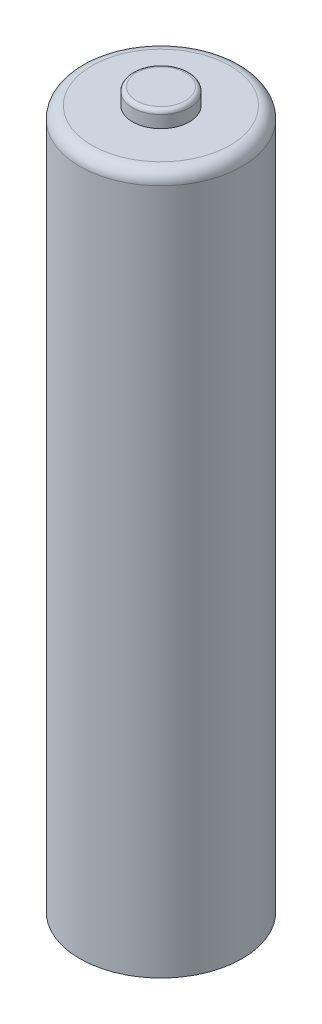
ISO-10303-21;
HEADER;
FILE_DESCRIPTION(('STEP AP214'),'2;1');
FILE_NAME('part.step','',(''),(''),'','','');
FILE_SCHEMA(('AUTOMOTIVE_DESIGN { 1 0 10303 214 1 1 1 1 }'));
ENDSEC;
DATA;
#1=APPLICATION_CONTEXT('core data for automotive mechanical design processes');
#2=APPLICATION_PROTOCOL_DEFINITION('international standard','automotive_design',2000,#1);
#3=PRODUCT_CONTEXT('',#1,'mechanical');
#4=PRODUCT('Part','Part','',(#3));
#5=PRODUCT_RELATED_PRODUCT_CATEGORY('part','',(#4));
#6=PRODUCT_DEFINITION_FORMATION('','',#4);
#7=PRODUCT_DEFINITION_CONTEXT('part definition',#1,'design');
#8=PRODUCT_DEFINITION('design','',#6,#7);
#9=PRODUCT_DEFINITION_SHAPE('','',#8);
#10=(LENGTH_UNIT() NAMED_UNIT(*) SI_UNIT(.MILLI.,.METRE.));
#11=(NAMED_UNIT(*) PLANE_ANGLE_UNIT() SI_UNIT($,.RADIAN.));
#12=(NAMED_UNIT(*) SI_UNIT($,.STERADIAN.) SOLID_ANGLE_UNIT());
#13=UNCERTAINTY_MEASURE_WITH_UNIT(LENGTH_MEASURE(1.E-05),#10,'distance_accuracy_value','');
#14=(GEOMETRIC_REPRESENTATION_CONTEXT(3) GLOBAL_UNCERTAINTY_ASSIGNED_CONTEXT((#13)) GLOBAL_UNIT_ASSIGNED_CONTEXT((#10,
#11,#12)) REPRESENTATION_CONTEXT('',''));
#15=CARTESIAN_POINT('',(0.,0.,0.));
#16=DIRECTION('',(0.,0.,1.));
#17=DIRECTION('',(1.,0.,0.));
#18=AXIS2_PLACEMENT_3D('',#15,#16,#17);
#19=CARTESIAN_POINT('',(0.,0.,0.));
#20=DIRECTION('',(0.,1.,0.));
#21=DIRECTION('',(0.,0.,1.));
#22=AXIS2_PLACEMENT_3D('',#19,#20,#21);
#23=PLANE('',#22);
#24=CARTESIAN_POINT('',(0.,0.,0.));
#25=DIRECTION('',(0.,1.,0.));
#26=DIRECTION('',(0.,0.,1.));
#27=AXIS2_PLACEMENT_3D('',#24,#25,#26);
#28=CIRCLE('',#27,4.25);
#29=CARTESIAN_POINT('',(0.,0.,4.25));
#30=VERTEX_POINT('',#29);
#31=EDGE_CURVE('E44',#30,#30,#28,.T.);
#32=ORIENTED_EDGE('',*,*,#31,.T.);
#33=EDGE_LOOP('',(#32));
#34=FACE_BOUND('',#33,.T.);
#35=CARTESIAN_POINT('',(0.,0.,0.));
#36=DIRECTION('',(0.,-1.,0.));
#37=DIRECTION('',(0.,0.,-1.));
#38=AXIS2_PLACEMENT_3D('',#35,#36,#37);
#39=CIRCLE('',#38,1.75);
#40=CARTESIAN_POINT('',(0.,0.,-1.75));
#41=VERTEX_POINT('',#40);
#42=EDGE_CURVE('E52',#41,#41,#39,.T.);
#43=ORIENTED_EDGE('',*,*,#42,.T.);
#44=EDGE_LOOP('',(#43));
#45=FACE_BOUND('',#44,.T.);
#46=ADVANCED_FACE('F29',(#34,#45),#23,.T.);
#47=CARTESIAN_POINT('',(0.,0.,0.));
#48=DIRECTION('',(0.,1.,0.));
#49=DIRECTION('',(0.,0.,1.));
#50=AXIS2_PLACEMENT_3D('',#47,#48,#49);
#51=CYLINDRICAL_SURFACE('',#50,5.);
#52=CARTESIAN_POINT('',(0.,-0.75,0.));
#53=DIRECTION('',(0.,1.,0.));
#54=DIRECTION('',(0.,0.,1.));
#55=AXIS2_PLACEMENT_3D('',#52,#53,#54);
#56=CIRCLE('',#55,5.);
#57=CARTESIAN_POINT('',(0.,-0.75,5.));
#58=VERTEX_POINT('',#57);
#59=EDGE_CURVE('E40',#58,#58,#56,.F.);
#60=ORIENTED_EDGE('',*,*,#59,.T.);
#61=EDGE_LOOP('',(#60));
#62=FACE_BOUND('',#61,.T.);
#63=CARTESIAN_POINT('',(0.,-43.,0.));
#64=DIRECTION('',(0.,1.,0.));
#65=DIRECTION('',(0.,0.,1.));
#66=AXIS2_PLACEMENT_3D('',#63,#64,#65);
#67=CIRCLE('',#66,4.99999999999999);
#68=CARTESIAN_POINT('',(0.,-43.,4.99999999999999));
#69=VERTEX_POINT('',#68);
#70=EDGE_CURVE('E49',#69,#69,#67,.T.);
#71=ORIENTED_EDGE('',*,*,#70,.T.);
#72=EDGE_LOOP('',(#71));
#73=FACE_BOUND('',#72,.T.);
#74=ADVANCED_FACE('F70',(#62,#73),#51,.T.);
#75=CARTESIAN_POINT('',(0.,-43.,0.));
#76=DIRECTION('',(0.,-1.,0.));
#77=DIRECTION('',(0.,0.,-1.));
#78=AXIS2_PLACEMENT_3D('',#75,#76,#77);
#79=PLANE('',#78);
#80=ORIENTED_EDGE('',*,*,#70,.F.);
#81=EDGE_LOOP('',(#80));
#82=FACE_BOUND('',#81,.T.);
#83=ADVANCED_FACE('F67',(#82),#79,.T.);
#84=CARTESIAN_POINT('',(0.,0.999999999999999,0.));
#85=DIRECTION('',(0.,-1.,0.));
#86=DIRECTION('',(0.,0.,-1.));
#87=AXIS2_PLACEMENT_3D('',#84,#85,#86);
#88=PLANE('',#87);
#89=CARTESIAN_POINT('',(0.,0.999999999999999,0.));
#90=DIRECTION('',(0.,-1.,0.));
#91=DIRECTION('',(0.,0.,-1.));
#92=AXIS2_PLACEMENT_3D('',#89,#90,#91);
#93=CIRCLE('',#92,1.5);
#94=CARTESIAN_POINT('',(0.,0.999999999999999,-1.5));
#95=VERTEX_POINT('',#94);
#96=EDGE_CURVE('E10',#95,#95,#93,.F.);
#97=ORIENTED_EDGE('',*,*,#96,.T.);
#98=EDGE_LOOP('',(#97));
#99=FACE_BOUND('',#98,.T.);
#100=ADVANCED_FACE('F60',(#99),#88,.F.);
#101=CARTESIAN_POINT('',(0.,0.,0.));
#102=DIRECTION('',(0.,-1.,0.));
#103=DIRECTION('',(0.,0.,-1.));
#104=AXIS2_PLACEMENT_3D('',#101,#102,#103);
#105=CYLINDRICAL_SURFACE('',#104,1.75);
#106=CARTESIAN_POINT('',(0.,0.749999999999999,0.));
#107=DIRECTION('',(0.,-1.,0.));
#108=DIRECTION('',(0.,0.,-1.));
#109=AXIS2_PLACEMENT_3D('',#106,#107,#108);
#110=CIRCLE('',#109,1.75);
#111=CARTESIAN_POINT('',(0.,0.749999999999999,-1.75));
#112=VERTEX_POINT('',#111);
#113=EDGE_CURVE('E36',#112,#112,#110,.T.);
#114=ORIENTED_EDGE('',*,*,#113,.T.);
#115=EDGE_LOOP('',(#114));
#116=FACE_BOUND('',#115,.T.);
#117=ORIENTED_EDGE('',*,*,#42,.F.);
#118=EDGE_LOOP('',(#117));
#119=FACE_BOUND('',#118,.T.);
#120=ADVANCED_FACE('F57',(#116,#119),#105,.T.);
#121=CARTESIAN_POINT('',(0.,-0.75,0.));
#122=DIRECTION('',(0.,1.,0.));
#123=DIRECTION('',(0.,0.,1.));
#124=AXIS2_PLACEMENT_3D('',#121,#122,#123);
#125=TOROIDAL_SURFACE('',#124,4.25,0.75);
#126=ORIENTED_EDGE('',*,*,#59,.F.);
#127=EDGE_LOOP('',(#126));
#128=FACE_BOUND('',#127,.T.);
#129=ORIENTED_EDGE('',*,*,#31,.F.);
#130=EDGE_LOOP('',(#129));
#131=FACE_BOUND('',#130,.T.);
#132=ADVANCED_FACE('F59',(#128,#131),#125,.T.);
#133=CARTESIAN_POINT('',(0.,0.749999999999999,0.));
#134=DIRECTION('',(0.,-1.,0.));
#135=DIRECTION('',(0.,0.,-1.));
#136=AXIS2_PLACEMENT_3D('',#133,#134,#135);
#137=TOROIDAL_SURFACE('',#136,1.5,0.25);
#138=ORIENTED_EDGE('',*,*,#96,.F.);
#139=EDGE_LOOP('',(#138));
#140=FACE_BOUND('',#139,.T.);
#141=ORIENTED_EDGE('',*,*,#113,.F.);
#142=EDGE_LOOP('',(#141));
#143=FACE_BOUND('',#142,.T.);
#144=ADVANCED_FACE('F31',(#140,#143),#137,.T.);
#145=CLOSED_SHELL('',(#46,#74,#83,#100,#120,#132,#144));
#146=MANIFOLD_SOLID_BREP('B2',#145);
#147=ADVANCED_BREP_SHAPE_REPRESENTATION('',(#18,#146),#14);
#148=SHAPE_DEFINITION_REPRESENTATION(#9,#147);
ENDSEC;
END-ISO-10303-21;
